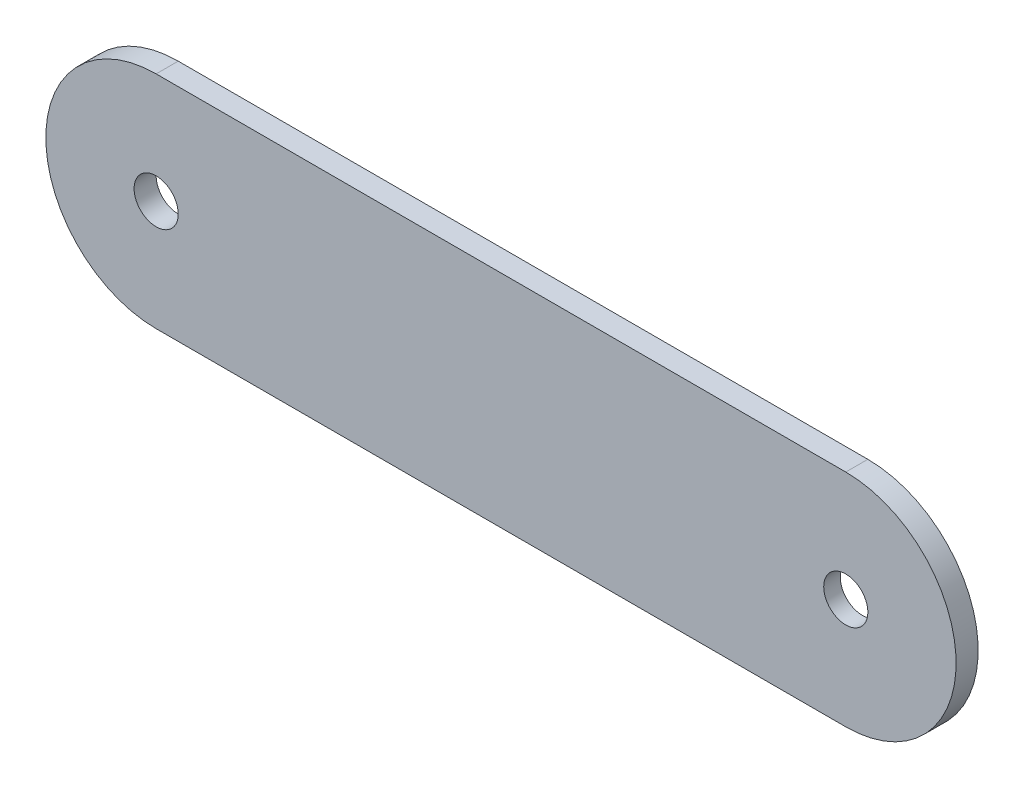
ISO-10303-21;
HEADER;
FILE_DESCRIPTION(('STEP AP214'),'2;1');
FILE_NAME('part.step','',(''),(''),'','','');
FILE_SCHEMA(('AUTOMOTIVE_DESIGN { 1 0 10303 214 1 1 1 1 }'));
ENDSEC;
DATA;
#1=APPLICATION_CONTEXT('core data for automotive mechanical design processes');
#2=APPLICATION_PROTOCOL_DEFINITION('international standard','automotive_design',2000,#1);
#3=PRODUCT_CONTEXT('',#1,'mechanical');
#4=PRODUCT('Part','Part','',(#3));
#5=PRODUCT_RELATED_PRODUCT_CATEGORY('part','',(#4));
#6=PRODUCT_DEFINITION_FORMATION('','',#4);
#7=PRODUCT_DEFINITION_CONTEXT('part definition',#1,'design');
#8=PRODUCT_DEFINITION('design','',#6,#7);
#9=PRODUCT_DEFINITION_SHAPE('','',#8);
#10=(LENGTH_UNIT() NAMED_UNIT(*) SI_UNIT(.MILLI.,.METRE.));
#11=(NAMED_UNIT(*) PLANE_ANGLE_UNIT() SI_UNIT($,.RADIAN.));
#12=(NAMED_UNIT(*) SI_UNIT($,.STERADIAN.) SOLID_ANGLE_UNIT());
#13=UNCERTAINTY_MEASURE_WITH_UNIT(LENGTH_MEASURE(1.E-05),#10,'distance_accuracy_value','');
#14=(GEOMETRIC_REPRESENTATION_CONTEXT(3) GLOBAL_UNCERTAINTY_ASSIGNED_CONTEXT((#13)) GLOBAL_UNIT_ASSIGNED_CONTEXT((#10,
#11,#12)) REPRESENTATION_CONTEXT('',''));
#15=CARTESIAN_POINT('',(0.,0.,0.));
#16=DIRECTION('',(0.,0.,1.));
#17=DIRECTION('',(1.,0.,0.));
#18=AXIS2_PLACEMENT_3D('',#15,#16,#17);
#19=CARTESIAN_POINT('',(474.747147129643,-0.576127472709589,0.));
#20=DIRECTION('',(0.,0.,1.));
#21=DIRECTION('',(1.,0.,0.));
#22=AXIS2_PLACEMENT_3D('',#19,#20,#21);
#23=PLANE('',#22);
#24=CARTESIAN_POINT('',(-150.252852870357,-0.576127472709663,0.));
#25=DIRECTION('',(0.,0.,1.));
#26=DIRECTION('',(1.,0.,0.));
#27=AXIS2_PLACEMENT_3D('',#24,#25,#26);
#28=CIRCLE('',#27,20.);
#29=CARTESIAN_POINT('',(-130.252852870357,-0.576127472709663,0.));
#30=VERTEX_POINT('',#29);
#31=EDGE_CURVE('E158',#30,#30,#28,.T.);
#32=ORIENTED_EDGE('',*,*,#31,.T.);
#33=EDGE_LOOP('',(#32));
#34=FACE_BOUND('',#33,.T.);
#35=CARTESIAN_POINT('',(-150.252852870357,-0.576127472709663,0.));
#36=DIRECTION('',(0.,0.,1.));
#37=DIRECTION('',(1.,0.,0.));
#38=AXIS2_PLACEMENT_3D('',#35,#36,#37);
#39=CIRCLE('',#38,25.);
#40=CARTESIAN_POINT('',(-125.252852870357,-0.576127472709663,0.));
#41=VERTEX_POINT('',#40);
#42=EDGE_CURVE('E230',#41,#41,#39,.T.);
#43=ORIENTED_EDGE('',*,*,#42,.F.);
#44=EDGE_LOOP('',(#43));
#45=FACE_BOUND('',#44,.T.);
#46=ADVANCED_FACE('F52',(#34,#45),#23,.F.);
#47=CARTESIAN_POINT('',(474.747147129643,-0.576127472709589,20.));
#48=DIRECTION('',(0.,0.,1.));
#49=DIRECTION('',(1.,0.,0.));
#50=AXIS2_PLACEMENT_3D('',#47,#48,#49);
#51=PLANE('',#50);
#52=CARTESIAN_POINT('',(-150.252852870357,-0.576127472709663,20.));
#53=DIRECTION('',(0.,0.,1.));
#54=DIRECTION('',(1.,0.,0.));
#55=AXIS2_PLACEMENT_3D('',#52,#53,#54);
#56=CIRCLE('',#55,20.);
#57=CARTESIAN_POINT('',(-130.252852870357,-0.576127472709663,20.));
#58=VERTEX_POINT('',#57);
#59=EDGE_CURVE('E159',#58,#58,#56,.T.);
#60=ORIENTED_EDGE('',*,*,#59,.F.);
#61=EDGE_LOOP('',(#60));
#62=FACE_BOUND('',#61,.T.);
#63=CARTESIAN_POINT('',(474.747147129643,-0.576127472709589,20.));
#64=DIRECTION('',(0.,0.,1.));
#65=DIRECTION('',(1.,0.,0.));
#66=AXIS2_PLACEMENT_3D('',#63,#64,#65);
#67=CIRCLE('',#66,100.);
#68=CARTESIAN_POINT('',(474.747147129643,-100.57612747271,20.));
#69=VERTEX_POINT('',#68);
#70=CARTESIAN_POINT('',(474.747147129643,99.4238725272904,20.));
#71=VERTEX_POINT('',#70);
#72=EDGE_CURVE('E165',#69,#71,#67,.T.);
#73=ORIENTED_EDGE('',*,*,#72,.T.);
#74=DIRECTION('',(-1.,0.,0.));
#75=VECTOR('',#74,1.);
#76=CARTESIAN_POINT('',(474.747147129643,99.4238725272904,20.));
#77=LINE('',#76,#75);
#78=CARTESIAN_POINT('',(-150.252852870357,99.4238725272903,20.));
#79=VERTEX_POINT('',#78);
#80=EDGE_CURVE('E105',#71,#79,#77,.T.);
#81=ORIENTED_EDGE('',*,*,#80,.T.);
#82=CARTESIAN_POINT('',(-150.252852870357,-0.576127472709663,20.));
#83=DIRECTION('',(0.,0.,1.));
#84=DIRECTION('',(1.,0.,0.));
#85=AXIS2_PLACEMENT_3D('',#82,#83,#84);
#86=CIRCLE('',#85,100.);
#87=CARTESIAN_POINT('',(-150.252852870357,-100.57612747271,20.));
#88=VERTEX_POINT('',#87);
#89=EDGE_CURVE('E168',#79,#88,#86,.T.);
#90=ORIENTED_EDGE('',*,*,#89,.T.);
#91=DIRECTION('',(1.,0.,0.));
#92=VECTOR('',#91,1.);
#93=CARTESIAN_POINT('',(474.747147129643,-100.57612747271,20.));
#94=LINE('',#93,#92);
#95=EDGE_CURVE('E77',#88,#69,#94,.T.);
#96=ORIENTED_EDGE('',*,*,#95,.T.);
#97=EDGE_LOOP('',(#73,#81,#90,#96));
#98=FACE_BOUND('',#97,.T.);
#99=CARTESIAN_POINT('',(474.747147129643,-0.576127472709589,20.));
#100=DIRECTION('',(0.,0.,1.));
#101=DIRECTION('',(-1.,0.,0.));
#102=AXIS2_PLACEMENT_3D('',#99,#100,#101);
#103=CIRCLE('',#102,19.9999999999999);
#104=CARTESIAN_POINT('',(454.747147129643,-0.576127472709589,20.));
#105=VERTEX_POINT('',#104);
#106=EDGE_CURVE('E151',#105,#105,#103,.T.);
#107=ORIENTED_EDGE('',*,*,#106,.F.);
#108=EDGE_LOOP('',(#107));
#109=FACE_BOUND('',#108,.T.);
#110=ADVANCED_FACE('F209',(#62,#98,#109),#51,.T.);
#111=DIRECTION('',(-1.,0.,0.));
#112=VECTOR('',#111,1.);
#113=CARTESIAN_POINT('',(474.747147129643,94.4238725272904,0.));
#114=LINE('',#113,#112);
#115=CARTESIAN_POINT('',(474.747147129643,94.4238725272904,0.));
#116=VERTEX_POINT('',#115);
#117=CARTESIAN_POINT('',(-150.252852870357,94.4238725272903,0.));
#118=VERTEX_POINT('',#117);
#119=EDGE_CURVE('E68',#116,#118,#114,.T.);
#120=ORIENTED_EDGE('',*,*,#119,.T.);
#121=CARTESIAN_POINT('',(-150.252852870357,-0.576127472709663,0.));
#122=DIRECTION('',(0.,0.,1.));
#123=DIRECTION('',(1.,0.,0.));
#124=AXIS2_PLACEMENT_3D('',#121,#122,#123);
#125=CIRCLE('',#124,95.);
#126=CARTESIAN_POINT('',(-150.252852870357,-95.5761274727097,0.));
#127=VERTEX_POINT('',#126);
#128=EDGE_CURVE('E147',#118,#127,#125,.T.);
#129=ORIENTED_EDGE('',*,*,#128,.T.);
#130=DIRECTION('',(1.,0.,0.));
#131=VECTOR('',#130,1.);
#132=CARTESIAN_POINT('',(-150.252852870357,-95.5761274727097,0.));
#133=LINE('',#132,#131);
#134=CARTESIAN_POINT('',(474.747147129643,-95.5761274727096,0.));
#135=VERTEX_POINT('',#134);
#136=EDGE_CURVE('E227',#127,#135,#133,.T.);
#137=ORIENTED_EDGE('',*,*,#136,.T.);
#138=CARTESIAN_POINT('',(474.747147129643,-0.576127472709589,0.));
#139=DIRECTION('',(0.,0.,1.));
#140=DIRECTION('',(1.,0.,0.));
#141=AXIS2_PLACEMENT_3D('',#138,#139,#140);
#142=CIRCLE('',#141,95.);
#143=EDGE_CURVE('E143',#135,#116,#142,.T.);
#144=ORIENTED_EDGE('',*,*,#143,.T.);
#145=EDGE_LOOP('',(#120,#129,#137,#144));
#146=FACE_BOUND('',#145,.T.);
#147=CARTESIAN_POINT('',(474.747147129643,-0.576127472709589,0.));
#148=DIRECTION('',(0.,0.,1.));
#149=DIRECTION('',(1.,0.,0.));
#150=AXIS2_PLACEMENT_3D('',#147,#148,#149);
#151=CIRCLE('',#150,100.);
#152=CARTESIAN_POINT('',(474.747147129643,-100.57612747271,0.));
#153=VERTEX_POINT('',#152);
#154=CARTESIAN_POINT('',(474.747147129643,99.4238725272904,0.));
#155=VERTEX_POINT('',#154);
#156=EDGE_CURVE('E162',#153,#155,#151,.T.);
#157=ORIENTED_EDGE('',*,*,#156,.F.);
#158=DIRECTION('',(1.,0.,0.));
#159=VECTOR('',#158,1.);
#160=CARTESIAN_POINT('',(474.747147129643,-100.57612747271,0.));
#161=LINE('',#160,#159);
#162=CARTESIAN_POINT('',(-150.252852870357,-100.57612747271,0.));
#163=VERTEX_POINT('',#162);
#164=EDGE_CURVE('E98',#163,#153,#161,.T.);
#165=ORIENTED_EDGE('',*,*,#164,.F.);
#166=CARTESIAN_POINT('',(-150.252852870357,-0.576127472709663,0.));
#167=DIRECTION('',(0.,0.,1.));
#168=DIRECTION('',(1.,0.,0.));
#169=AXIS2_PLACEMENT_3D('',#166,#167,#168);
#170=CIRCLE('',#169,100.);
#171=CARTESIAN_POINT('',(-150.252852870357,99.4238725272903,0.));
#172=VERTEX_POINT('',#171);
#173=EDGE_CURVE('E176',#172,#163,#170,.T.);
#174=ORIENTED_EDGE('',*,*,#173,.F.);
#175=DIRECTION('',(-1.,0.,0.));
#176=VECTOR('',#175,1.);
#177=CARTESIAN_POINT('',(474.747147129643,99.4238725272904,0.));
#178=LINE('',#177,#176);
#179=EDGE_CURVE('E174',#155,#172,#178,.T.);
#180=ORIENTED_EDGE('',*,*,#179,.F.);
#181=EDGE_LOOP('',(#157,#165,#174,#180));
#182=FACE_BOUND('',#181,.T.);
#183=ADVANCED_FACE('F190',(#146,#182),#23,.F.);
#184=CARTESIAN_POINT('',(474.747147129643,-0.576127472709589,20.));
#185=DIRECTION('',(0.,0.,-1.));
#186=DIRECTION('',(-1.,0.,0.));
#187=AXIS2_PLACEMENT_3D('',#184,#185,#186);
#188=CYLINDRICAL_SURFACE('',#187,100.);
#189=ORIENTED_EDGE('',*,*,#156,.T.);
#190=DIRECTION('',(0.,0.,-1.));
#191=VECTOR('',#190,1.);
#192=CARTESIAN_POINT('',(474.747147129643,99.4238725272904,20.));
#193=LINE('',#192,#191);
#194=EDGE_CURVE('E12',#71,#155,#193,.T.);
#195=ORIENTED_EDGE('',*,*,#194,.F.);
#196=ORIENTED_EDGE('',*,*,#72,.F.);
#197=DIRECTION('',(0.,0.,-1.));
#198=VECTOR('',#197,1.);
#199=CARTESIAN_POINT('',(474.747147129643,-100.57612747271,20.));
#200=LINE('',#199,#198);
#201=EDGE_CURVE('E171',#69,#153,#200,.T.);
#202=ORIENTED_EDGE('',*,*,#201,.T.);
#203=EDGE_LOOP('',(#189,#195,#196,#202));
#204=FACE_BOUND('',#203,.T.);
#205=ADVANCED_FACE('F54',(#204),#188,.T.);
#206=CARTESIAN_POINT('',(474.747147129643,99.4238725272904,20.));
#207=DIRECTION('',(0.,-1.,0.));
#208=DIRECTION('',(1.,0.,0.));
#209=AXIS2_PLACEMENT_3D('',#206,#207,#208);
#210=PLANE('',#209);
#211=ORIENTED_EDGE('',*,*,#179,.T.);
#212=DIRECTION('',(0.,0.,-1.));
#213=VECTOR('',#212,1.);
#214=CARTESIAN_POINT('',(-150.252852870357,99.4238725272903,20.));
#215=LINE('',#214,#213);
#216=EDGE_CURVE('E61',#79,#172,#215,.T.);
#217=ORIENTED_EDGE('',*,*,#216,.F.);
#218=ORIENTED_EDGE('',*,*,#80,.F.);
#219=ORIENTED_EDGE('',*,*,#194,.T.);
#220=EDGE_LOOP('',(#211,#217,#218,#219));
#221=FACE_BOUND('',#220,.T.);
#222=ADVANCED_FACE('F205',(#221),#210,.F.);
#223=CARTESIAN_POINT('',(-150.252852870357,-0.576127472709663,20.));
#224=DIRECTION('',(0.,0.,-1.));
#225=DIRECTION('',(-1.,0.,0.));
#226=AXIS2_PLACEMENT_3D('',#223,#224,#225);
#227=CYLINDRICAL_SURFACE('',#226,100.);
#228=ORIENTED_EDGE('',*,*,#173,.T.);
#229=DIRECTION('',(0.,0.,-1.));
#230=VECTOR('',#229,1.);
#231=CARTESIAN_POINT('',(-150.252852870357,-100.57612747271,20.));
#232=LINE('',#231,#230);
#233=EDGE_CURVE('E180',#88,#163,#232,.T.);
#234=ORIENTED_EDGE('',*,*,#233,.F.);
#235=ORIENTED_EDGE('',*,*,#89,.F.);
#236=ORIENTED_EDGE('',*,*,#216,.T.);
#237=EDGE_LOOP('',(#228,#234,#235,#236));
#238=FACE_BOUND('',#237,.T.);
#239=ADVANCED_FACE('F186',(#238),#227,.T.);
#240=CARTESIAN_POINT('',(474.747147129643,-100.57612747271,20.));
#241=DIRECTION('',(0.,1.,0.));
#242=DIRECTION('',(-1.,0.,0.));
#243=AXIS2_PLACEMENT_3D('',#240,#241,#242);
#244=PLANE('',#243);
#245=ORIENTED_EDGE('',*,*,#164,.T.);
#246=ORIENTED_EDGE('',*,*,#201,.F.);
#247=ORIENTED_EDGE('',*,*,#95,.F.);
#248=ORIENTED_EDGE('',*,*,#233,.T.);
#249=EDGE_LOOP('',(#245,#246,#247,#248));
#250=FACE_BOUND('',#249,.T.);
#251=ADVANCED_FACE('F194',(#250),#244,.F.);
#252=CARTESIAN_POINT('',(-150.252852870357,-0.576127472709663,20.));
#253=DIRECTION('',(0.,0.,-1.));
#254=DIRECTION('',(-1.,0.,0.));
#255=AXIS2_PLACEMENT_3D('',#252,#253,#254);
#256=CYLINDRICAL_SURFACE('',#255,20.);
#257=ORIENTED_EDGE('',*,*,#59,.T.);
#258=EDGE_LOOP('',(#257));
#259=FACE_BOUND('',#258,.T.);
#260=ORIENTED_EDGE('',*,*,#31,.F.);
#261=EDGE_LOOP('',(#260));
#262=FACE_BOUND('',#261,.T.);
#263=ADVANCED_FACE('F196',(#259,#262),#256,.F.);
#264=CARTESIAN_POINT('',(474.747147129643,-0.576127472709589,20.));
#265=DIRECTION('',(0.,0.,-1.));
#266=DIRECTION('',(-1.,0.,0.));
#267=AXIS2_PLACEMENT_3D('',#264,#265,#266);
#268=CYLINDRICAL_SURFACE('',#267,19.9999999999999);
#269=CARTESIAN_POINT('',(474.747147129643,-0.576127472709589,5.));
#270=DIRECTION('',(0.,0.,1.));
#271=DIRECTION('',(1.,0.,0.));
#272=AXIS2_PLACEMENT_3D('',#269,#270,#271);
#273=CIRCLE('',#272,19.9999999999999);
#274=CARTESIAN_POINT('',(494.747147129643,-0.576127472709589,5.));
#275=VERTEX_POINT('',#274);
#276=EDGE_CURVE('E56',#275,#275,#273,.T.);
#277=ORIENTED_EDGE('',*,*,#276,.F.);
#278=EDGE_LOOP('',(#277));
#279=FACE_BOUND('',#278,.T.);
#280=ORIENTED_EDGE('',*,*,#106,.T.);
#281=EDGE_LOOP('',(#280));
#282=FACE_BOUND('',#281,.T.);
#283=ADVANCED_FACE('F202',(#279,#282),#268,.F.);
#284=CARTESIAN_POINT('',(-150.252852870357,-0.576127472709663,5.));
#285=DIRECTION('',(0.,0.,1.));
#286=DIRECTION('',(1.,0.,0.));
#287=AXIS2_PLACEMENT_3D('',#284,#285,#286);
#288=PLANE('',#287);
#289=ORIENTED_EDGE('',*,*,#276,.T.);
#290=EDGE_LOOP('',(#289));
#291=FACE_BOUND('',#290,.T.);
#292=DIRECTION('',(-1.,0.,0.));
#293=VECTOR('',#292,1.);
#294=CARTESIAN_POINT('',(474.747147129643,94.4238725272904,5.));
#295=LINE('',#294,#293);
#296=CARTESIAN_POINT('',(474.747147129643,94.4238725272904,5.));
#297=VERTEX_POINT('',#296);
#298=CARTESIAN_POINT('',(-150.252852870357,94.4238725272903,5.));
#299=VERTEX_POINT('',#298);
#300=EDGE_CURVE('E134',#297,#299,#295,.T.);
#301=ORIENTED_EDGE('',*,*,#300,.F.);
#302=CARTESIAN_POINT('',(474.747147129643,-0.576127472709589,5.));
#303=DIRECTION('',(0.,0.,1.));
#304=DIRECTION('',(1.,0.,0.));
#305=AXIS2_PLACEMENT_3D('',#302,#303,#304);
#306=CIRCLE('',#305,95.);
#307=CARTESIAN_POINT('',(474.747147129643,-95.5761274727096,5.));
#308=VERTEX_POINT('',#307);
#309=EDGE_CURVE('E233',#308,#297,#306,.T.);
#310=ORIENTED_EDGE('',*,*,#309,.F.);
#311=DIRECTION('',(1.,0.,0.));
#312=VECTOR('',#311,1.);
#313=CARTESIAN_POINT('',(-150.252852870357,-95.5761274727097,5.));
#314=LINE('',#313,#312);
#315=CARTESIAN_POINT('',(-150.252852870357,-95.5761274727097,5.));
#316=VERTEX_POINT('',#315);
#317=EDGE_CURVE('E135',#316,#308,#314,.T.);
#318=ORIENTED_EDGE('',*,*,#317,.F.);
#319=CARTESIAN_POINT('',(-150.252852870357,-0.576127472709663,5.));
#320=DIRECTION('',(0.,0.,1.));
#321=DIRECTION('',(1.,0.,0.));
#322=AXIS2_PLACEMENT_3D('',#319,#320,#321);
#323=CIRCLE('',#322,95.);
#324=EDGE_CURVE('E129',#299,#316,#323,.T.);
#325=ORIENTED_EDGE('',*,*,#324,.F.);
#326=EDGE_LOOP('',(#301,#310,#318,#325));
#327=FACE_BOUND('',#326,.T.);
#328=CARTESIAN_POINT('',(-150.252852870357,-0.576127472709663,5.));
#329=DIRECTION('',(0.,0.,1.));
#330=DIRECTION('',(1.,0.,0.));
#331=AXIS2_PLACEMENT_3D('',#328,#329,#330);
#332=CIRCLE('',#331,25.);
#333=CARTESIAN_POINT('',(-125.252852870357,-0.576127472709663,5.));
#334=VERTEX_POINT('',#333);
#335=EDGE_CURVE('E225',#334,#334,#332,.T.);
#336=ORIENTED_EDGE('',*,*,#335,.T.);
#337=EDGE_LOOP('',(#336));
#338=FACE_BOUND('',#337,.T.);
#339=ADVANCED_FACE('F131',(#291,#327,#338),#288,.F.);
#340=CARTESIAN_POINT('',(474.747147129643,94.4238725272904,5.));
#341=DIRECTION('',(0.,-1.,0.));
#342=DIRECTION('',(1.,0.,0.));
#343=AXIS2_PLACEMENT_3D('',#340,#341,#342);
#344=PLANE('',#343);
#345=ORIENTED_EDGE('',*,*,#119,.F.);
#346=DIRECTION('',(0.,0.,-1.));
#347=VECTOR('',#346,1.);
#348=CARTESIAN_POINT('',(474.747147129643,94.4238725272904,5.));
#349=LINE('',#348,#347);
#350=EDGE_CURVE('E142',#297,#116,#349,.T.);
#351=ORIENTED_EDGE('',*,*,#350,.F.);
#352=ORIENTED_EDGE('',*,*,#300,.T.);
#353=DIRECTION('',(0.,0.,-1.));
#354=VECTOR('',#353,1.);
#355=CARTESIAN_POINT('',(-150.252852870357,94.4238725272903,5.));
#356=LINE('',#355,#354);
#357=EDGE_CURVE('E141',#299,#118,#356,.T.);
#358=ORIENTED_EDGE('',*,*,#357,.T.);
#359=EDGE_LOOP('',(#345,#351,#352,#358));
#360=FACE_BOUND('',#359,.T.);
#361=ADVANCED_FACE('F140',(#360),#344,.T.);
#362=CARTESIAN_POINT('',(-150.252852870357,-0.576127472709663,5.));
#363=DIRECTION('',(0.,0.,-1.));
#364=DIRECTION('',(-1.,0.,0.));
#365=AXIS2_PLACEMENT_3D('',#362,#363,#364);
#366=CYLINDRICAL_SURFACE('',#365,95.);
#367=ORIENTED_EDGE('',*,*,#128,.F.);
#368=ORIENTED_EDGE('',*,*,#357,.F.);
#369=ORIENTED_EDGE('',*,*,#324,.T.);
#370=DIRECTION('',(0.,0.,-1.));
#371=VECTOR('',#370,1.);
#372=CARTESIAN_POINT('',(-150.252852870357,-95.5761274727097,5.));
#373=LINE('',#372,#371);
#374=EDGE_CURVE('E148',#316,#127,#373,.T.);
#375=ORIENTED_EDGE('',*,*,#374,.T.);
#376=EDGE_LOOP('',(#367,#368,#369,#375));
#377=FACE_BOUND('',#376,.T.);
#378=ADVANCED_FACE('F145',(#377),#366,.F.);
#379=CARTESIAN_POINT('',(-150.252852870357,-95.5761274727097,5.));
#380=DIRECTION('',(0.,1.,0.));
#381=DIRECTION('',(-1.,0.,0.));
#382=AXIS2_PLACEMENT_3D('',#379,#380,#381);
#383=PLANE('',#382);
#384=ORIENTED_EDGE('',*,*,#136,.F.);
#385=ORIENTED_EDGE('',*,*,#374,.F.);
#386=ORIENTED_EDGE('',*,*,#317,.T.);
#387=DIRECTION('',(0.,0.,-1.));
#388=VECTOR('',#387,1.);
#389=CARTESIAN_POINT('',(474.747147129643,-95.5761274727096,5.));
#390=LINE('',#389,#388);
#391=EDGE_CURVE('E152',#308,#135,#390,.T.);
#392=ORIENTED_EDGE('',*,*,#391,.T.);
#393=EDGE_LOOP('',(#384,#385,#386,#392));
#394=FACE_BOUND('',#393,.T.);
#395=ADVANCED_FACE('F241',(#394),#383,.T.);
#396=CARTESIAN_POINT('',(474.747147129643,-0.576127472709589,5.));
#397=DIRECTION('',(0.,0.,-1.));
#398=DIRECTION('',(-1.,0.,0.));
#399=AXIS2_PLACEMENT_3D('',#396,#397,#398);
#400=CYLINDRICAL_SURFACE('',#399,95.);
#401=ORIENTED_EDGE('',*,*,#143,.F.);
#402=ORIENTED_EDGE('',*,*,#391,.F.);
#403=ORIENTED_EDGE('',*,*,#309,.T.);
#404=ORIENTED_EDGE('',*,*,#350,.T.);
#405=EDGE_LOOP('',(#401,#402,#403,#404));
#406=FACE_BOUND('',#405,.T.);
#407=ADVANCED_FACE('F243',(#406),#400,.F.);
#408=CARTESIAN_POINT('',(-150.252852870357,-0.576127472709663,5.));
#409=DIRECTION('',(0.,0.,-1.));
#410=DIRECTION('',(-1.,0.,0.));
#411=AXIS2_PLACEMENT_3D('',#408,#409,#410);
#412=CYLINDRICAL_SURFACE('',#411,25.);
#413=ORIENTED_EDGE('',*,*,#335,.F.);
#414=EDGE_LOOP('',(#413));
#415=FACE_BOUND('',#414,.T.);
#416=ORIENTED_EDGE('',*,*,#42,.T.);
#417=EDGE_LOOP('',(#416));
#418=FACE_BOUND('',#417,.T.);
#419=ADVANCED_FACE('F248',(#415,#418),#412,.T.);
#420=CLOSED_SHELL('',(#46,#110,#183,#205,#222,#239,#251,#263,#283,#339,#361,#378,#395,#407,#419));
#421=MANIFOLD_SOLID_BREP('B2',#420);
#422=ADVANCED_BREP_SHAPE_REPRESENTATION('',(#18,#421),#14);
#423=SHAPE_DEFINITION_REPRESENTATION(#9,#422);
ENDSEC;
END-ISO-10303-21;
